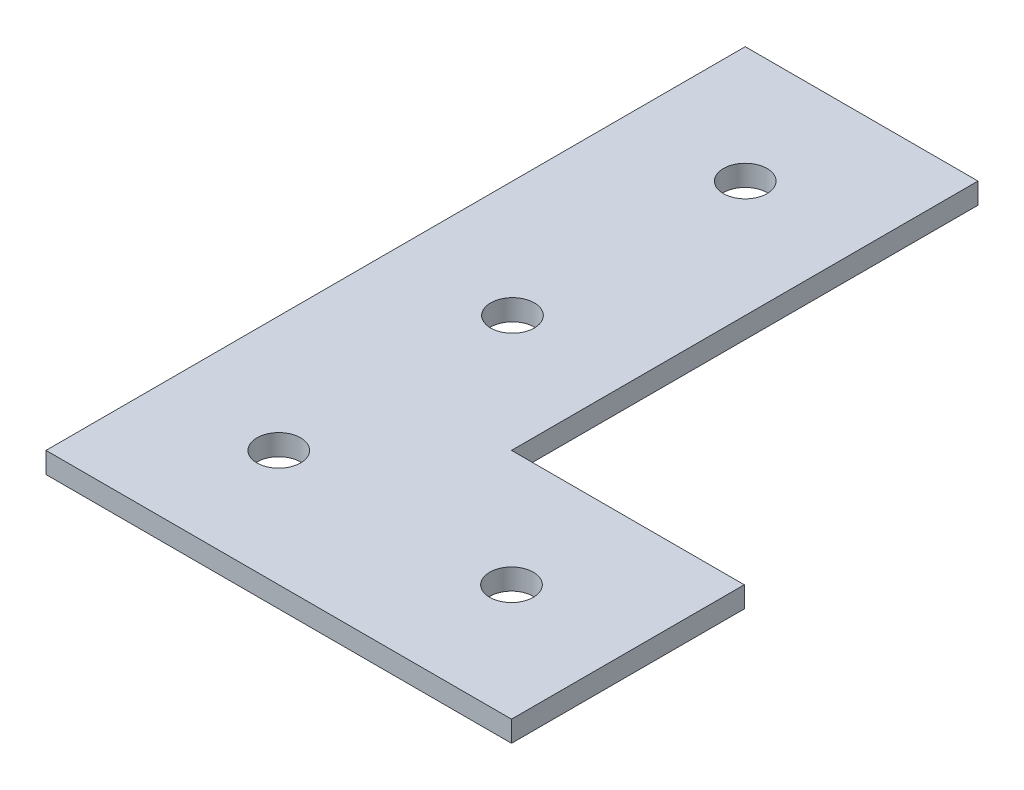
ISO-10303-21;
HEADER;
FILE_DESCRIPTION(('STEP AP214'),'2;1');
FILE_NAME('part.step','',(''),(''),'','','');
FILE_SCHEMA(('AUTOMOTIVE_DESIGN { 1 0 10303 214 1 1 1 1 }'));
ENDSEC;
DATA;
#1=APPLICATION_CONTEXT('core data for automotive mechanical design processes');
#2=APPLICATION_PROTOCOL_DEFINITION('international standard','automotive_design',2000,#1);
#3=PRODUCT_CONTEXT('',#1,'mechanical');
#4=PRODUCT('Part','Part','',(#3));
#5=PRODUCT_RELATED_PRODUCT_CATEGORY('part','',(#4));
#6=PRODUCT_DEFINITION_FORMATION('','',#4);
#7=PRODUCT_DEFINITION_CONTEXT('part definition',#1,'design');
#8=PRODUCT_DEFINITION('design','',#6,#7);
#9=PRODUCT_DEFINITION_SHAPE('','',#8);
#10=(LENGTH_UNIT() NAMED_UNIT(*) SI_UNIT(.MILLI.,.METRE.));
#11=(NAMED_UNIT(*) PLANE_ANGLE_UNIT() SI_UNIT($,.RADIAN.));
#12=(NAMED_UNIT(*) SI_UNIT($,.STERADIAN.) SOLID_ANGLE_UNIT());
#13=UNCERTAINTY_MEASURE_WITH_UNIT(LENGTH_MEASURE(1.E-05),#10,'distance_accuracy_value','');
#14=(GEOMETRIC_REPRESENTATION_CONTEXT(3) GLOBAL_UNCERTAINTY_ASSIGNED_CONTEXT((#13)) GLOBAL_UNIT_ASSIGNED_CONTEXT((#10,
#11,#12)) REPRESENTATION_CONTEXT('',''));
#15=CARTESIAN_POINT('',(0.,0.,0.));
#16=DIRECTION('',(0.,0.,1.));
#17=DIRECTION('',(1.,0.,0.));
#18=AXIS2_PLACEMENT_3D('',#15,#16,#17);
#19=CARTESIAN_POINT('',(0.,2.286,0.));
#20=DIRECTION('',(-1.,0.,0.));
#21=DIRECTION('',(0.,0.,1.));
#22=AXIS2_PLACEMENT_3D('',#19,#20,#21);
#23=PLANE('',#22);
#24=DIRECTION('',(0.,0.,-1.));
#25=VECTOR('',#24,1.);
#26=CARTESIAN_POINT('',(0.,0.,0.));
#27=LINE('',#26,#25);
#28=CARTESIAN_POINT('',(0.,0.,0.));
#29=VERTEX_POINT('',#28);
#30=CARTESIAN_POINT('',(0.,0.,-25.4));
#31=VERTEX_POINT('',#30);
#32=EDGE_CURVE('E116',#29,#31,#27,.T.);
#33=ORIENTED_EDGE('',*,*,#32,.T.);
#34=DIRECTION('',(0.,-1.,0.));
#35=VECTOR('',#34,1.);
#36=CARTESIAN_POINT('',(0.,2.286,-25.4));
#37=LINE('',#36,#35);
#38=CARTESIAN_POINT('',(0.,2.286,-25.4));
#39=VERTEX_POINT('',#38);
#40=EDGE_CURVE('E11',#39,#31,#37,.T.);
#41=ORIENTED_EDGE('',*,*,#40,.F.);
#42=DIRECTION('',(0.,0.,-1.));
#43=VECTOR('',#42,1.);
#44=CARTESIAN_POINT('',(0.,2.286,0.));
#45=LINE('',#44,#43);
#46=CARTESIAN_POINT('',(0.,2.286,0.));
#47=VERTEX_POINT('',#46);
#48=EDGE_CURVE('E127',#47,#39,#45,.T.);
#49=ORIENTED_EDGE('',*,*,#48,.F.);
#50=DIRECTION('',(0.,-1.,0.));
#51=VECTOR('',#50,1.);
#52=CARTESIAN_POINT('',(0.,2.286,0.));
#53=LINE('',#52,#51);
#54=EDGE_CURVE('E112',#47,#29,#53,.T.);
#55=ORIENTED_EDGE('',*,*,#54,.T.);
#56=EDGE_LOOP('',(#33,#41,#49,#55));
#57=FACE_BOUND('',#56,.T.);
#58=ADVANCED_FACE('F32',(#57),#23,.F.);
#59=CARTESIAN_POINT('',(-25.4,2.286,-25.4));
#60=DIRECTION('',(0.,0.,1.));
#61=DIRECTION('',(1.,0.,0.));
#62=AXIS2_PLACEMENT_3D('',#59,#60,#61);
#63=PLANE('',#62);
#64=DIRECTION('',(-1.,0.,0.));
#65=VECTOR('',#64,1.);
#66=CARTESIAN_POINT('',(-25.4,0.,-25.4));
#67=LINE('',#66,#65);
#68=CARTESIAN_POINT('',(-25.4,0.,-25.4));
#69=VERTEX_POINT('',#68);
#70=EDGE_CURVE('E119',#31,#69,#67,.T.);
#71=ORIENTED_EDGE('',*,*,#70,.T.);
#72=DIRECTION('',(0.,-1.,0.));
#73=VECTOR('',#72,1.);
#74=CARTESIAN_POINT('',(-25.4,2.286,-25.4));
#75=LINE('',#74,#73);
#76=CARTESIAN_POINT('',(-25.4,2.286,-25.4));
#77=VERTEX_POINT('',#76);
#78=EDGE_CURVE('E40',#77,#69,#75,.T.);
#79=ORIENTED_EDGE('',*,*,#78,.F.);
#80=DIRECTION('',(-1.,0.,0.));
#81=VECTOR('',#80,1.);
#82=CARTESIAN_POINT('',(-25.4,2.286,-25.4));
#83=LINE('',#82,#81);
#84=EDGE_CURVE('E85',#39,#77,#83,.T.);
#85=ORIENTED_EDGE('',*,*,#84,.F.);
#86=ORIENTED_EDGE('',*,*,#40,.T.);
#87=EDGE_LOOP('',(#71,#79,#85,#86));
#88=FACE_BOUND('',#87,.T.);
#89=ADVANCED_FACE('F152',(#88),#63,.F.);
#90=CARTESIAN_POINT('',(-25.4,2.286,-76.304784010116));
#91=DIRECTION('',(-1.,0.,0.));
#92=DIRECTION('',(0.,0.,1.));
#93=AXIS2_PLACEMENT_3D('',#90,#91,#92);
#94=PLANE('',#93);
#95=DIRECTION('',(0.,0.,-1.));
#96=VECTOR('',#95,1.);
#97=CARTESIAN_POINT('',(-25.4,0.,-76.304784010116));
#98=LINE('',#97,#96);
#99=CARTESIAN_POINT('',(-25.4,0.,-76.304784010116));
#100=VERTEX_POINT('',#99);
#101=EDGE_CURVE('E122',#69,#100,#98,.T.);
#102=ORIENTED_EDGE('',*,*,#101,.T.);
#103=DIRECTION('',(0.,-1.,0.));
#104=VECTOR('',#103,1.);
#105=CARTESIAN_POINT('',(-25.4,2.286,-76.304784010116));
#106=LINE('',#105,#104);
#107=CARTESIAN_POINT('',(-25.4,2.286,-76.304784010116));
#108=VERTEX_POINT('',#107);
#109=EDGE_CURVE('E107',#108,#100,#106,.T.);
#110=ORIENTED_EDGE('',*,*,#109,.F.);
#111=DIRECTION('',(0.,0.,-1.));
#112=VECTOR('',#111,1.);
#113=CARTESIAN_POINT('',(-25.4,2.286,-76.304784010116));
#114=LINE('',#113,#112);
#115=EDGE_CURVE('E98',#77,#108,#114,.T.);
#116=ORIENTED_EDGE('',*,*,#115,.F.);
#117=ORIENTED_EDGE('',*,*,#78,.T.);
#118=EDGE_LOOP('',(#102,#110,#116,#117));
#119=FACE_BOUND('',#118,.T.);
#120=ADVANCED_FACE('F133',(#119),#94,.F.);
#121=CARTESIAN_POINT('',(-25.4,2.286,-76.304784010116));
#122=DIRECTION('',(0.,0.,1.));
#123=DIRECTION('',(1.,0.,0.));
#124=AXIS2_PLACEMENT_3D('',#121,#122,#123);
#125=PLANE('',#124);
#126=DIRECTION('',(-1.,0.,0.));
#127=VECTOR('',#126,1.);
#128=CARTESIAN_POINT('',(-25.4,0.,-76.304784010116));
#129=LINE('',#128,#127);
#130=CARTESIAN_POINT('',(-50.8,0.,-76.304784010116));
#131=VERTEX_POINT('',#130);
#132=EDGE_CURVE('E106',#100,#131,#129,.T.);
#133=ORIENTED_EDGE('',*,*,#132,.T.);
#134=DIRECTION('',(0.,-1.,0.));
#135=VECTOR('',#134,1.);
#136=CARTESIAN_POINT('',(-50.8,2.286,-76.304784010116));
#137=LINE('',#136,#135);
#138=CARTESIAN_POINT('',(-50.8,2.286,-76.304784010116));
#139=VERTEX_POINT('',#138);
#140=EDGE_CURVE('E103',#139,#131,#137,.T.);
#141=ORIENTED_EDGE('',*,*,#140,.F.);
#142=DIRECTION('',(-1.,0.,0.));
#143=VECTOR('',#142,1.);
#144=CARTESIAN_POINT('',(-25.4,2.286,-76.304784010116));
#145=LINE('',#144,#143);
#146=EDGE_CURVE('E92',#108,#139,#145,.T.);
#147=ORIENTED_EDGE('',*,*,#146,.F.);
#148=ORIENTED_EDGE('',*,*,#109,.T.);
#149=EDGE_LOOP('',(#133,#141,#147,#148));
#150=FACE_BOUND('',#149,.T.);
#151=ADVANCED_FACE('F104',(#150),#125,.F.);
#152=CARTESIAN_POINT('',(-50.8,2.286,0.));
#153=DIRECTION('',(1.,0.,0.));
#154=DIRECTION('',(0.,0.,-1.));
#155=AXIS2_PLACEMENT_3D('',#152,#153,#154);
#156=PLANE('',#155);
#157=DIRECTION('',(0.,0.,1.));
#158=VECTOR('',#157,1.);
#159=CARTESIAN_POINT('',(-50.8,0.,0.));
#160=LINE('',#159,#158);
#161=CARTESIAN_POINT('',(-50.8,0.,0.));
#162=VERTEX_POINT('',#161);
#163=EDGE_CURVE('E71',#131,#162,#160,.T.);
#164=ORIENTED_EDGE('',*,*,#163,.T.);
#165=DIRECTION('',(0.,-1.,0.));
#166=VECTOR('',#165,1.);
#167=CARTESIAN_POINT('',(-50.8,2.286,0.));
#168=LINE('',#167,#166);
#169=CARTESIAN_POINT('',(-50.8,2.286,0.));
#170=VERTEX_POINT('',#169);
#171=EDGE_CURVE('E108',#170,#162,#168,.T.);
#172=ORIENTED_EDGE('',*,*,#171,.F.);
#173=DIRECTION('',(0.,0.,1.));
#174=VECTOR('',#173,1.);
#175=CARTESIAN_POINT('',(-50.8,2.286,0.));
#176=LINE('',#175,#174);
#177=EDGE_CURVE('E96',#139,#170,#176,.T.);
#178=ORIENTED_EDGE('',*,*,#177,.F.);
#179=ORIENTED_EDGE('',*,*,#140,.T.);
#180=EDGE_LOOP('',(#164,#172,#178,#179));
#181=FACE_BOUND('',#180,.T.);
#182=ADVANCED_FACE('F110',(#181),#156,.F.);
#183=CARTESIAN_POINT('',(0.,2.286,0.));
#184=DIRECTION('',(0.,0.,-1.));
#185=DIRECTION('',(-1.,0.,0.));
#186=AXIS2_PLACEMENT_3D('',#183,#184,#185);
#187=PLANE('',#186);
#188=DIRECTION('',(1.,0.,0.));
#189=VECTOR('',#188,1.);
#190=CARTESIAN_POINT('',(0.,0.,0.));
#191=LINE('',#190,#189);
#192=EDGE_CURVE('E77',#162,#29,#191,.T.);
#193=ORIENTED_EDGE('',*,*,#192,.T.);
#194=ORIENTED_EDGE('',*,*,#54,.F.);
#195=DIRECTION('',(1.,0.,0.));
#196=VECTOR('',#195,1.);
#197=CARTESIAN_POINT('',(0.,2.286,0.));
#198=LINE('',#197,#196);
#199=EDGE_CURVE('E48',#170,#47,#198,.T.);
#200=ORIENTED_EDGE('',*,*,#199,.F.);
#201=ORIENTED_EDGE('',*,*,#171,.T.);
#202=EDGE_LOOP('',(#193,#194,#200,#201));
#203=FACE_BOUND('',#202,.T.);
#204=ADVANCED_FACE('F140',(#203),#187,.F.);
#205=CARTESIAN_POINT('',(0.,2.286,0.));
#206=DIRECTION('',(0.,-1.,0.));
#207=DIRECTION('',(0.,0.,-1.));
#208=AXIS2_PLACEMENT_3D('',#205,#206,#207);
#209=PLANE('',#208);
#210=CARTESIAN_POINT('',(-38.1,2.286,-63.604784010116));
#211=DIRECTION('',(0.,1.,0.));
#212=DIRECTION('',(0.,0.,1.));
#213=AXIS2_PLACEMENT_3D('',#210,#211,#212);
#214=CIRCLE('',#213,2.38124999999999);
#215=CARTESIAN_POINT('',(-38.1,2.286,-61.223534010116));
#216=VERTEX_POINT('',#215);
#217=EDGE_CURVE('E238',#216,#216,#214,.T.);
#218=ORIENTED_EDGE('',*,*,#217,.F.);
#219=EDGE_LOOP('',(#218));
#220=FACE_BOUND('',#219,.T.);
#221=CARTESIAN_POINT('',(-38.1,2.286,-38.204784010116));
#222=DIRECTION('',(0.,1.,0.));
#223=DIRECTION('',(0.,0.,1.));
#224=AXIS2_PLACEMENT_3D('',#221,#222,#223);
#225=CIRCLE('',#224,2.38124999999999);
#226=CARTESIAN_POINT('',(-38.1,2.286,-35.823534010116));
#227=VERTEX_POINT('',#226);
#228=EDGE_CURVE('E240',#227,#227,#225,.T.);
#229=ORIENTED_EDGE('',*,*,#228,.F.);
#230=EDGE_LOOP('',(#229));
#231=FACE_BOUND('',#230,.T.);
#232=CARTESIAN_POINT('',(-38.1,2.286,-12.7));
#233=DIRECTION('',(0.,1.,0.));
#234=DIRECTION('',(0.,0.,1.));
#235=AXIS2_PLACEMENT_3D('',#232,#233,#234);
#236=CIRCLE('',#235,2.38124999999999);
#237=CARTESIAN_POINT('',(-38.1,2.286,-10.31875));
#238=VERTEX_POINT('',#237);
#239=EDGE_CURVE('E248',#238,#238,#236,.T.);
#240=ORIENTED_EDGE('',*,*,#239,.F.);
#241=EDGE_LOOP('',(#240));
#242=FACE_BOUND('',#241,.T.);
#243=CARTESIAN_POINT('',(-12.7,2.286,-12.7));
#244=DIRECTION('',(0.,1.,0.));
#245=DIRECTION('',(0.,0.,1.));
#246=AXIS2_PLACEMENT_3D('',#243,#244,#245);
#247=CIRCLE('',#246,2.38124999999999);
#248=CARTESIAN_POINT('',(-12.7,2.286,-10.31875));
#249=VERTEX_POINT('',#248);
#250=EDGE_CURVE('E254',#249,#249,#247,.T.);
#251=ORIENTED_EDGE('',*,*,#250,.F.);
#252=EDGE_LOOP('',(#251));
#253=FACE_BOUND('',#252,.T.);
#254=ORIENTED_EDGE('',*,*,#48,.T.);
#255=ORIENTED_EDGE('',*,*,#84,.T.);
#256=ORIENTED_EDGE('',*,*,#115,.T.);
#257=ORIENTED_EDGE('',*,*,#146,.T.);
#258=ORIENTED_EDGE('',*,*,#177,.T.);
#259=ORIENTED_EDGE('',*,*,#199,.T.);
#260=EDGE_LOOP('',(#254,#255,#256,#257,#258,#259));
#261=FACE_BOUND('',#260,.T.);
#262=ADVANCED_FACE('F94',(#220,#231,#242,#253,#261),#209,.F.);
#263=CARTESIAN_POINT('',(0.,0.,0.));
#264=DIRECTION('',(0.,-1.,0.));
#265=DIRECTION('',(0.,0.,-1.));
#266=AXIS2_PLACEMENT_3D('',#263,#264,#265);
#267=PLANE('',#266);
#268=CARTESIAN_POINT('',(-38.1,0.,-63.604784010116));
#269=DIRECTION('',(0.,1.,0.));
#270=DIRECTION('',(0.,0.,1.));
#271=AXIS2_PLACEMENT_3D('',#268,#269,#270);
#272=CIRCLE('',#271,2.38124999999999);
#273=CARTESIAN_POINT('',(-38.1,0.,-61.223534010116));
#274=VERTEX_POINT('',#273);
#275=EDGE_CURVE('E235',#274,#274,#272,.T.);
#276=ORIENTED_EDGE('',*,*,#275,.T.);
#277=EDGE_LOOP('',(#276));
#278=FACE_BOUND('',#277,.T.);
#279=CARTESIAN_POINT('',(-38.1,0.,-38.204784010116));
#280=DIRECTION('',(0.,1.,0.));
#281=DIRECTION('',(0.,0.,1.));
#282=AXIS2_PLACEMENT_3D('',#279,#280,#281);
#283=CIRCLE('',#282,2.38124999999999);
#284=CARTESIAN_POINT('',(-38.1,0.,-35.823534010116));
#285=VERTEX_POINT('',#284);
#286=EDGE_CURVE('E245',#285,#285,#283,.T.);
#287=ORIENTED_EDGE('',*,*,#286,.T.);
#288=EDGE_LOOP('',(#287));
#289=FACE_BOUND('',#288,.T.);
#290=CARTESIAN_POINT('',(-38.1,0.,-12.7));
#291=DIRECTION('',(0.,1.,0.));
#292=DIRECTION('',(0.,0.,1.));
#293=AXIS2_PLACEMENT_3D('',#290,#291,#292);
#294=CIRCLE('',#293,2.38124999999999);
#295=CARTESIAN_POINT('',(-38.1,0.,-10.31875));
#296=VERTEX_POINT('',#295);
#297=EDGE_CURVE('E251',#296,#296,#294,.T.);
#298=ORIENTED_EDGE('',*,*,#297,.T.);
#299=EDGE_LOOP('',(#298));
#300=FACE_BOUND('',#299,.T.);
#301=CARTESIAN_POINT('',(-12.7,0.,-12.7));
#302=DIRECTION('',(0.,1.,0.));
#303=DIRECTION('',(0.,0.,1.));
#304=AXIS2_PLACEMENT_3D('',#301,#302,#303);
#305=CIRCLE('',#304,2.38124999999999);
#306=CARTESIAN_POINT('',(-12.7,0.,-10.31875));
#307=VERTEX_POINT('',#306);
#308=EDGE_CURVE('E120',#307,#307,#305,.T.);
#309=ORIENTED_EDGE('',*,*,#308,.T.);
#310=EDGE_LOOP('',(#309));
#311=FACE_BOUND('',#310,.T.);
#312=ORIENTED_EDGE('',*,*,#32,.F.);
#313=ORIENTED_EDGE('',*,*,#192,.F.);
#314=ORIENTED_EDGE('',*,*,#163,.F.);
#315=ORIENTED_EDGE('',*,*,#132,.F.);
#316=ORIENTED_EDGE('',*,*,#101,.F.);
#317=ORIENTED_EDGE('',*,*,#70,.F.);
#318=EDGE_LOOP('',(#312,#313,#314,#315,#316,#317));
#319=FACE_BOUND('',#318,.T.);
#320=ADVANCED_FACE('F136',(#278,#289,#300,#311,#319),#267,.T.);
#321=CARTESIAN_POINT('',(-12.7,2.286,-12.7));
#322=DIRECTION('',(0.,1.,0.));
#323=DIRECTION('',(0.,0.,1.));
#324=AXIS2_PLACEMENT_3D('',#321,#322,#323);
#325=CYLINDRICAL_SURFACE('',#324,2.38124999999999);
#326=ORIENTED_EDGE('',*,*,#308,.F.);
#327=EDGE_LOOP('',(#326));
#328=FACE_BOUND('',#327,.T.);
#329=ORIENTED_EDGE('',*,*,#250,.T.);
#330=EDGE_LOOP('',(#329));
#331=FACE_BOUND('',#330,.T.);
#332=ADVANCED_FACE('F189',(#328,#331),#325,.F.);
#333=CARTESIAN_POINT('',(-38.1,2.286,-12.7));
#334=DIRECTION('',(0.,1.,0.));
#335=DIRECTION('',(0.,0.,1.));
#336=AXIS2_PLACEMENT_3D('',#333,#334,#335);
#337=CYLINDRICAL_SURFACE('',#336,2.38124999999999);
#338=ORIENTED_EDGE('',*,*,#297,.F.);
#339=EDGE_LOOP('',(#338));
#340=FACE_BOUND('',#339,.T.);
#341=ORIENTED_EDGE('',*,*,#239,.T.);
#342=EDGE_LOOP('',(#341));
#343=FACE_BOUND('',#342,.T.);
#344=ADVANCED_FACE('F198',(#340,#343),#337,.F.);
#345=CARTESIAN_POINT('',(-38.1,2.286,-38.204784010116));
#346=DIRECTION('',(0.,1.,0.));
#347=DIRECTION('',(0.,0.,1.));
#348=AXIS2_PLACEMENT_3D('',#345,#346,#347);
#349=CYLINDRICAL_SURFACE('',#348,2.38124999999999);
#350=ORIENTED_EDGE('',*,*,#286,.F.);
#351=EDGE_LOOP('',(#350));
#352=FACE_BOUND('',#351,.T.);
#353=ORIENTED_EDGE('',*,*,#228,.T.);
#354=EDGE_LOOP('',(#353));
#355=FACE_BOUND('',#354,.T.);
#356=ADVANCED_FACE('F208',(#352,#355),#349,.F.);
#357=CARTESIAN_POINT('',(-38.1,2.286,-63.604784010116));
#358=DIRECTION('',(0.,1.,0.));
#359=DIRECTION('',(0.,0.,1.));
#360=AXIS2_PLACEMENT_3D('',#357,#358,#359);
#361=CYLINDRICAL_SURFACE('',#360,2.38124999999999);
#362=ORIENTED_EDGE('',*,*,#275,.F.);
#363=EDGE_LOOP('',(#362));
#364=FACE_BOUND('',#363,.T.);
#365=ORIENTED_EDGE('',*,*,#217,.T.);
#366=EDGE_LOOP('',(#365));
#367=FACE_BOUND('',#366,.T.);
#368=ADVANCED_FACE('F218',(#364,#367),#361,.F.);
#369=CLOSED_SHELL('',(#58,#89,#120,#151,#182,#204,#262,#320,#332,#344,#356,#368));
#370=MANIFOLD_SOLID_BREP('B2',#369);
#371=ADVANCED_BREP_SHAPE_REPRESENTATION('',(#18,#370),#14);
#372=SHAPE_DEFINITION_REPRESENTATION(#9,#371);
ENDSEC;
END-ISO-10303-21;
